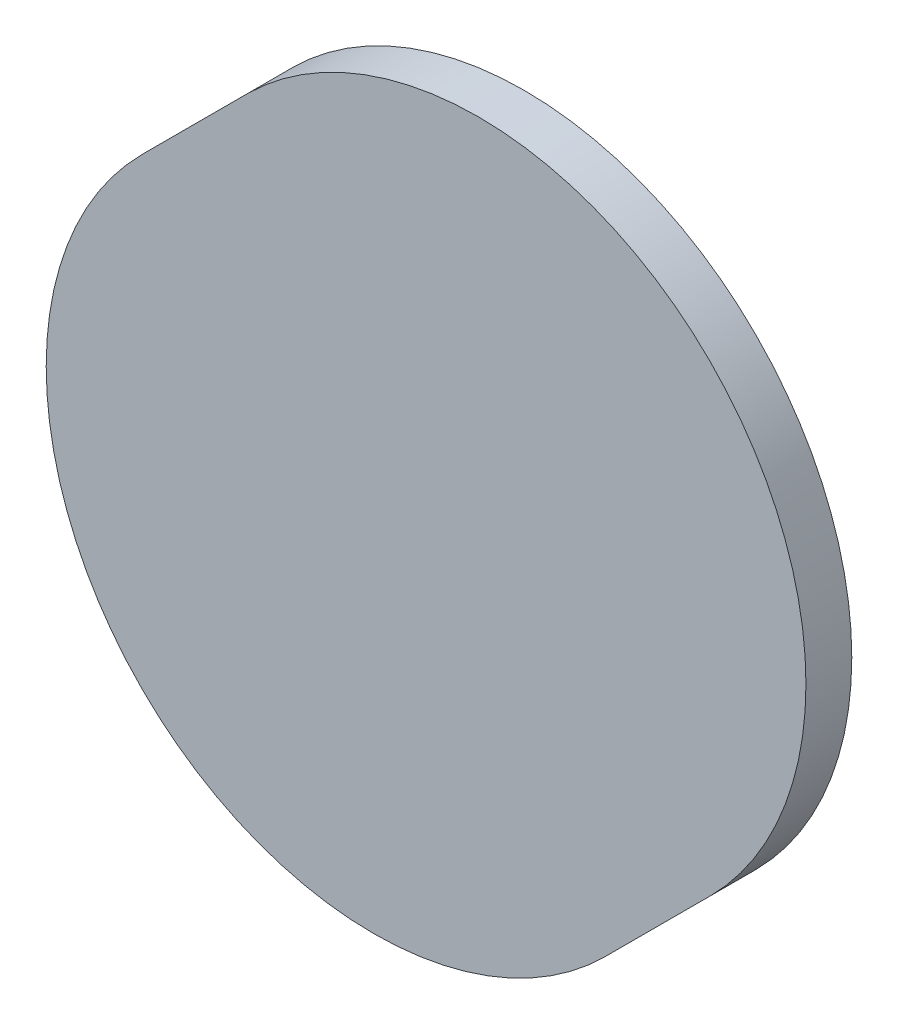
ISO-10303-21;
HEADER;
FILE_DESCRIPTION(('STEP AP214'),'2;1');
FILE_NAME('part.step','',(''),(''),'','','');
FILE_SCHEMA(('AUTOMOTIVE_DESIGN { 1 0 10303 214 1 1 1 1 }'));
ENDSEC;
DATA;
#1=APPLICATION_CONTEXT('core data for automotive mechanical design processes');
#2=APPLICATION_PROTOCOL_DEFINITION('international standard','automotive_design',2000,#1);
#3=PRODUCT_CONTEXT('',#1,'mechanical');
#4=PRODUCT('Part','Part','',(#3));
#5=PRODUCT_RELATED_PRODUCT_CATEGORY('part','',(#4));
#6=PRODUCT_DEFINITION_FORMATION('','',#4);
#7=PRODUCT_DEFINITION_CONTEXT('part definition',#1,'design');
#8=PRODUCT_DEFINITION('design','',#6,#7);
#9=PRODUCT_DEFINITION_SHAPE('','',#8);
#10=(LENGTH_UNIT() NAMED_UNIT(*) SI_UNIT(.MILLI.,.METRE.));
#11=(NAMED_UNIT(*) PLANE_ANGLE_UNIT() SI_UNIT($,.RADIAN.));
#12=(NAMED_UNIT(*) SI_UNIT($,.STERADIAN.) SOLID_ANGLE_UNIT());
#13=UNCERTAINTY_MEASURE_WITH_UNIT(LENGTH_MEASURE(1.E-05),#10,'distance_accuracy_value','');
#14=(GEOMETRIC_REPRESENTATION_CONTEXT(3) GLOBAL_UNCERTAINTY_ASSIGNED_CONTEXT((#13)) GLOBAL_UNIT_ASSIGNED_CONTEXT((#10,
#11,#12)) REPRESENTATION_CONTEXT('',''));
#15=CARTESIAN_POINT('',(0.,0.,0.));
#16=DIRECTION('',(0.,0.,1.));
#17=DIRECTION('',(1.,0.,0.));
#18=AXIS2_PLACEMENT_3D('',#15,#16,#17);
#19=CARTESIAN_POINT('',(107.936776,-99.856776,1.635));
#20=DIRECTION('',(0.,0.,1.));
#21=DIRECTION('',(1.,0.,0.));
#22=AXIS2_PLACEMENT_3D('',#19,#20,#21);
#23=PLANE('',#22);
#24=DIRECTION('',(0.707106781186548,0.707106781186548,0.));
#25=VECTOR('',#24,1.);
#26=CARTESIAN_POINT('',(107.936776,-99.856776,1.635));
#27=LINE('',#26,#25);
#28=CARTESIAN_POINT('',(107.936776,-99.856776,1.635));
#29=VERTEX_POINT('',#28);
#30=CARTESIAN_POINT('',(108.016776,-99.776776,1.635));
#31=VERTEX_POINT('',#30);
#32=EDGE_CURVE('E91',#29,#31,#27,.T.);
#33=ORIENTED_EDGE('',*,*,#32,.T.);
#34=CARTESIAN_POINT('',(107.8399995,-99.5999995,1.635));
#35=DIRECTION('',(0.,0.,1.));
#36=DIRECTION('',(0.707106781186548,-0.707106781186548,0.));
#37=AXIS2_PLACEMENT_3D('',#34,#35,#36);
#38=CIRCLE('',#37,0.249999723809);
#39=CARTESIAN_POINT('',(107.663223,-99.423223,1.635));
#40=VERTEX_POINT('',#39);
#41=EDGE_CURVE('E68',#31,#40,#38,.T.);
#42=ORIENTED_EDGE('',*,*,#41,.T.);
#43=DIRECTION('',(-0.707106781186048,-0.707106781187048,0.));
#44=VECTOR('',#43,1.);
#45=CARTESIAN_POINT('',(107.663223,-99.423223,1.635));
#46=LINE('',#45,#44);
#47=CARTESIAN_POINT('',(107.583223,-99.503223,1.635));
#48=VERTEX_POINT('',#47);
#49=EDGE_CURVE('E85',#40,#48,#46,.T.);
#50=ORIENTED_EDGE('',*,*,#49,.T.);
#51=CARTESIAN_POINT('',(107.7599995,-99.6799995,1.635));
#52=DIRECTION('',(0.,0.,1.));
#53=DIRECTION('',(-0.707106781186548,0.707106781186548,0.));
#54=AXIS2_PLACEMENT_3D('',#51,#52,#53);
#55=CIRCLE('',#54,0.249999723809);
#56=EDGE_CURVE('E11',#48,#29,#55,.T.);
#57=ORIENTED_EDGE('',*,*,#56,.T.);
#58=EDGE_LOOP('',(#33,#42,#50,#57));
#59=FACE_BOUND('',#58,.T.);
#60=ADVANCED_FACE('F17',(#59),#23,.T.);
#61=CARTESIAN_POINT('',(107.936776,-99.856776,1.6));
#62=DIRECTION('',(0.,0.,1.));
#63=DIRECTION('',(1.,0.,0.));
#64=AXIS2_PLACEMENT_3D('',#61,#62,#63);
#65=PLANE('',#64);
#66=CARTESIAN_POINT('',(107.7599995,-99.6799995,1.6));
#67=DIRECTION('',(0.,0.,1.));
#68=DIRECTION('',(-0.707106781186548,0.707106781186548,0.));
#69=AXIS2_PLACEMENT_3D('',#66,#67,#68);
#70=CIRCLE('',#69,0.249999723809);
#71=CARTESIAN_POINT('',(107.583223,-99.503223,1.6));
#72=VERTEX_POINT('',#71);
#73=CARTESIAN_POINT('',(107.936776,-99.856776,1.6));
#74=VERTEX_POINT('',#73);
#75=EDGE_CURVE('E25',#72,#74,#70,.T.);
#76=ORIENTED_EDGE('',*,*,#75,.F.);
#77=DIRECTION('',(-0.707106781186048,-0.707106781187048,0.));
#78=VECTOR('',#77,1.);
#79=CARTESIAN_POINT('',(107.663223,-99.423223,1.6));
#80=LINE('',#79,#78);
#81=CARTESIAN_POINT('',(107.663223,-99.423223,1.6));
#82=VERTEX_POINT('',#81);
#83=EDGE_CURVE('E106',#82,#72,#80,.T.);
#84=ORIENTED_EDGE('',*,*,#83,.F.);
#85=CARTESIAN_POINT('',(107.8399995,-99.5999995,1.6));
#86=DIRECTION('',(0.,0.,1.));
#87=DIRECTION('',(0.707106781186548,-0.707106781186548,0.));
#88=AXIS2_PLACEMENT_3D('',#85,#86,#87);
#89=CIRCLE('',#88,0.249999723809);
#90=CARTESIAN_POINT('',(108.016776,-99.776776,1.6));
#91=VERTEX_POINT('',#90);
#92=EDGE_CURVE('E74',#91,#82,#89,.T.);
#93=ORIENTED_EDGE('',*,*,#92,.F.);
#94=DIRECTION('',(0.707106781186548,0.707106781186548,0.));
#95=VECTOR('',#94,1.);
#96=CARTESIAN_POINT('',(107.936776,-99.856776,1.6));
#97=LINE('',#96,#95);
#98=EDGE_CURVE('E90',#74,#91,#97,.T.);
#99=ORIENTED_EDGE('',*,*,#98,.F.);
#100=EDGE_LOOP('',(#76,#84,#93,#99));
#101=FACE_BOUND('',#100,.T.);
#102=ADVANCED_FACE('F94',(#101),#65,.F.);
#103=CARTESIAN_POINT('',(107.7599995,-99.6799995,1.6));
#104=DIRECTION('',(0.,0.,-1.));
#105=DIRECTION('',(-0.707106781186548,0.707106781186548,0.));
#106=AXIS2_PLACEMENT_3D('',#103,#104,#105);
#107=CYLINDRICAL_SURFACE('',#106,0.249999723809);
#108=ORIENTED_EDGE('',*,*,#75,.T.);
#109=DIRECTION('',(0.,0.,1.));
#110=VECTOR('',#109,1.);
#111=CARTESIAN_POINT('',(107.936776,-99.856776,1.6));
#112=LINE('',#111,#110);
#113=EDGE_CURVE('E79',#74,#29,#112,.T.);
#114=ORIENTED_EDGE('',*,*,#113,.T.);
#115=ORIENTED_EDGE('',*,*,#56,.F.);
#116=DIRECTION('',(0.,0.,1.));
#117=VECTOR('',#116,1.);
#118=CARTESIAN_POINT('',(107.583223,-99.503223,1.6));
#119=LINE('',#118,#117);
#120=EDGE_CURVE('E82',#72,#48,#119,.T.);
#121=ORIENTED_EDGE('',*,*,#120,.F.);
#122=EDGE_LOOP('',(#108,#114,#115,#121));
#123=FACE_BOUND('',#122,.T.);
#124=ADVANCED_FACE('F78',(#123),#107,.T.);
#125=CARTESIAN_POINT('',(107.663223,-99.423223,1.6));
#126=DIRECTION('',(0.707106781187048,-0.707106781186048,0.));
#127=DIRECTION('',(0.,0.,-1.));
#128=AXIS2_PLACEMENT_3D('',#125,#126,#127);
#129=PLANE('',#128);
#130=ORIENTED_EDGE('',*,*,#83,.T.);
#131=ORIENTED_EDGE('',*,*,#120,.T.);
#132=ORIENTED_EDGE('',*,*,#49,.F.);
#133=DIRECTION('',(0.,0.,1.));
#134=VECTOR('',#133,1.);
#135=CARTESIAN_POINT('',(107.663223,-99.423223,1.6));
#136=LINE('',#135,#134);
#137=EDGE_CURVE('E107',#82,#40,#136,.T.);
#138=ORIENTED_EDGE('',*,*,#137,.F.);
#139=EDGE_LOOP('',(#130,#131,#132,#138));
#140=FACE_BOUND('',#139,.T.);
#141=ADVANCED_FACE('F123',(#140),#129,.F.);
#142=CARTESIAN_POINT('',(107.8399995,-99.5999995,1.6));
#143=DIRECTION('',(0.,0.,-1.));
#144=DIRECTION('',(0.707106781186548,-0.707106781186548,0.));
#145=AXIS2_PLACEMENT_3D('',#142,#143,#144);
#146=CYLINDRICAL_SURFACE('',#145,0.249999723809);
#147=ORIENTED_EDGE('',*,*,#92,.T.);
#148=ORIENTED_EDGE('',*,*,#137,.T.);
#149=ORIENTED_EDGE('',*,*,#41,.F.);
#150=DIRECTION('',(0.,0.,1.));
#151=VECTOR('',#150,1.);
#152=CARTESIAN_POINT('',(108.016776,-99.776776,1.6));
#153=LINE('',#152,#151);
#154=EDGE_CURVE('E96',#91,#31,#153,.T.);
#155=ORIENTED_EDGE('',*,*,#154,.F.);
#156=EDGE_LOOP('',(#147,#148,#149,#155));
#157=FACE_BOUND('',#156,.T.);
#158=ADVANCED_FACE('F124',(#157),#146,.T.);
#159=CARTESIAN_POINT('',(107.936776,-99.856776,1.6));
#160=DIRECTION('',(-0.707106781186548,0.707106781186548,0.));
#161=DIRECTION('',(0.,0.,1.));
#162=AXIS2_PLACEMENT_3D('',#159,#160,#161);
#163=PLANE('',#162);
#164=ORIENTED_EDGE('',*,*,#98,.T.);
#165=ORIENTED_EDGE('',*,*,#154,.T.);
#166=ORIENTED_EDGE('',*,*,#32,.F.);
#167=ORIENTED_EDGE('',*,*,#113,.F.);
#168=EDGE_LOOP('',(#164,#165,#166,#167));
#169=FACE_BOUND('',#168,.T.);
#170=ADVANCED_FACE('F88',(#169),#163,.F.);
#171=CLOSED_SHELL('',(#60,#102,#124,#141,#158,#170));
#172=MANIFOLD_SOLID_BREP('B1',#171);
#173=ADVANCED_BREP_SHAPE_REPRESENTATION('',(#18,#172),#14);
#174=SHAPE_DEFINITION_REPRESENTATION(#9,#173);
ENDSEC;
END-ISO-10303-21;
